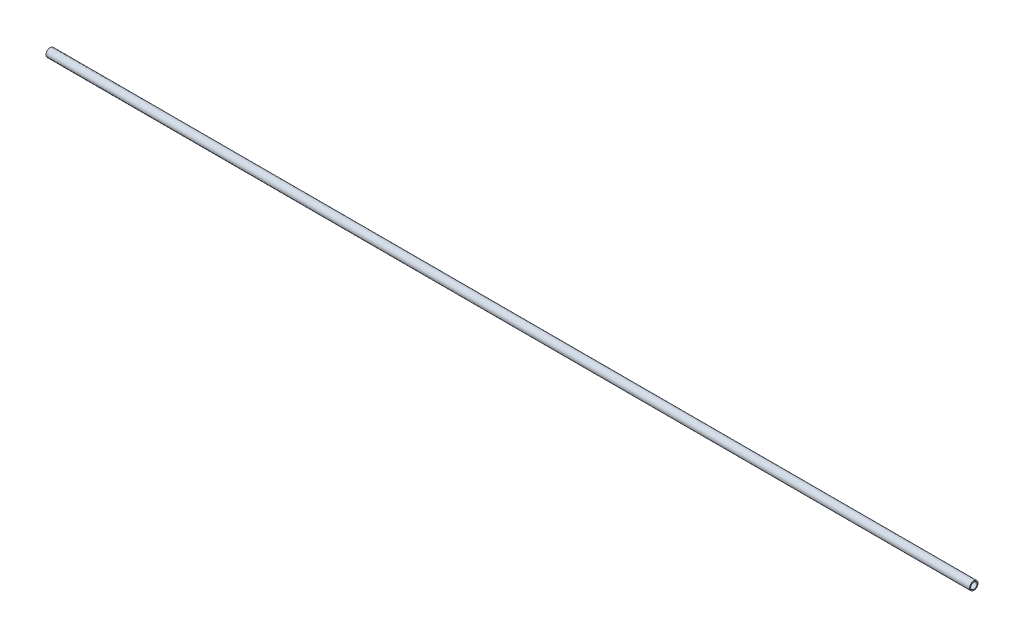
ISO-10303-21;
HEADER;
FILE_DESCRIPTION(('STEP AP214'),'2;1');
FILE_NAME('part.step','',(''),(''),'','','');
FILE_SCHEMA(('AUTOMOTIVE_DESIGN { 1 0 10303 214 1 1 1 1 }'));
ENDSEC;
DATA;
#1=APPLICATION_CONTEXT('core data for automotive mechanical design processes');
#2=APPLICATION_PROTOCOL_DEFINITION('international standard','automotive_design',2000,#1);
#3=PRODUCT_CONTEXT('',#1,'mechanical');
#4=PRODUCT('Part','Part','',(#3));
#5=PRODUCT_RELATED_PRODUCT_CATEGORY('part','',(#4));
#6=PRODUCT_DEFINITION_FORMATION('','',#4);
#7=PRODUCT_DEFINITION_CONTEXT('part definition',#1,'design');
#8=PRODUCT_DEFINITION('design','',#6,#7);
#9=PRODUCT_DEFINITION_SHAPE('','',#8);
#10=(LENGTH_UNIT() NAMED_UNIT(*) SI_UNIT(.MILLI.,.METRE.));
#11=(NAMED_UNIT(*) PLANE_ANGLE_UNIT() SI_UNIT($,.RADIAN.));
#12=(NAMED_UNIT(*) SI_UNIT($,.STERADIAN.) SOLID_ANGLE_UNIT());
#13=UNCERTAINTY_MEASURE_WITH_UNIT(LENGTH_MEASURE(1.E-05),#10,'distance_accuracy_value','');
#14=(GEOMETRIC_REPRESENTATION_CONTEXT(3) GLOBAL_UNCERTAINTY_ASSIGNED_CONTEXT((#13)) GLOBAL_UNIT_ASSIGNED_CONTEXT((#10,
#11,#12)) REPRESENTATION_CONTEXT('',''));
#15=CARTESIAN_POINT('',(0.,0.,0.));
#16=DIRECTION('',(0.,0.,1.));
#17=DIRECTION('',(1.,0.,0.));
#18=AXIS2_PLACEMENT_3D('',#15,#16,#17);
#19=CARTESIAN_POINT('',(2800.,0.,0.));
#20=DIRECTION('',(1.,0.,0.));
#21=DIRECTION('',(0.,0.,-1.));
#22=AXIS2_PLACEMENT_3D('',#19,#20,#21);
#23=PLANE('',#22);
#24=CARTESIAN_POINT('',(2800.,0.,0.));
#25=DIRECTION('',(1.,0.,0.));
#26=DIRECTION('',(0.,0.,-1.));
#27=AXIS2_PLACEMENT_3D('',#24,#25,#26);
#28=CIRCLE('',#27,12.7);
#29=CARTESIAN_POINT('',(2800.,0.,-12.7));
#30=VERTEX_POINT('',#29);
#31=EDGE_CURVE('E10',#30,#30,#28,.T.);
#32=ORIENTED_EDGE('',*,*,#31,.T.);
#33=EDGE_LOOP('',(#32));
#34=FACE_BOUND('',#33,.T.);
#35=CARTESIAN_POINT('',(2800.,0.,0.));
#36=DIRECTION('',(1.,0.,0.));
#37=DIRECTION('',(0.,0.,-1.));
#38=AXIS2_PLACEMENT_3D('',#35,#36,#37);
#39=CIRCLE('',#38,9.652);
#40=CARTESIAN_POINT('',(2800.,0.,-9.652));
#41=VERTEX_POINT('',#40);
#42=EDGE_CURVE('E47',#41,#41,#39,.T.);
#43=ORIENTED_EDGE('',*,*,#42,.F.);
#44=EDGE_LOOP('',(#43));
#45=FACE_BOUND('',#44,.T.);
#46=ADVANCED_FACE('F36',(#34,#45),#23,.T.);
#47=CARTESIAN_POINT('',(0.,0.,0.));
#48=DIRECTION('',(1.,0.,0.));
#49=DIRECTION('',(0.,0.,-1.));
#50=AXIS2_PLACEMENT_3D('',#47,#48,#49);
#51=PLANE('',#50);
#52=CARTESIAN_POINT('',(0.,0.,0.));
#53=DIRECTION('',(1.,0.,0.));
#54=DIRECTION('',(0.,0.,-1.));
#55=AXIS2_PLACEMENT_3D('',#52,#53,#54);
#56=CIRCLE('',#55,12.7);
#57=CARTESIAN_POINT('',(0.,0.,-12.7));
#58=VERTEX_POINT('',#57);
#59=EDGE_CURVE('E40',#58,#58,#56,.T.);
#60=ORIENTED_EDGE('',*,*,#59,.F.);
#61=EDGE_LOOP('',(#60));
#62=FACE_BOUND('',#61,.T.);
#63=CARTESIAN_POINT('',(0.,0.,0.));
#64=DIRECTION('',(1.,0.,0.));
#65=DIRECTION('',(0.,0.,-1.));
#66=AXIS2_PLACEMENT_3D('',#63,#64,#65);
#67=CIRCLE('',#66,9.652);
#68=CARTESIAN_POINT('',(0.,0.,-9.652));
#69=VERTEX_POINT('',#68);
#70=EDGE_CURVE('E49',#69,#69,#67,.T.);
#71=ORIENTED_EDGE('',*,*,#70,.T.);
#72=EDGE_LOOP('',(#71));
#73=FACE_BOUND('',#72,.T.);
#74=ADVANCED_FACE('F59',(#62,#73),#51,.F.);
#75=CARTESIAN_POINT('',(2800.,0.,0.));
#76=DIRECTION('',(-1.,0.,0.));
#77=DIRECTION('',(0.,0.,1.));
#78=AXIS2_PLACEMENT_3D('',#75,#76,#77);
#79=CYLINDRICAL_SURFACE('',#78,12.7);
#80=ORIENTED_EDGE('',*,*,#31,.F.);
#81=EDGE_LOOP('',(#80));
#82=FACE_BOUND('',#81,.T.);
#83=ORIENTED_EDGE('',*,*,#59,.T.);
#84=EDGE_LOOP('',(#83));
#85=FACE_BOUND('',#84,.T.);
#86=ADVANCED_FACE('F38',(#82,#85),#79,.T.);
#87=CARTESIAN_POINT('',(2800.,0.,0.));
#88=DIRECTION('',(-1.,0.,0.));
#89=DIRECTION('',(0.,0.,1.));
#90=AXIS2_PLACEMENT_3D('',#87,#88,#89);
#91=CYLINDRICAL_SURFACE('',#90,9.652);
#92=ORIENTED_EDGE('',*,*,#42,.T.);
#93=EDGE_LOOP('',(#92));
#94=FACE_BOUND('',#93,.T.);
#95=ORIENTED_EDGE('',*,*,#70,.F.);
#96=EDGE_LOOP('',(#95));
#97=FACE_BOUND('',#96,.T.);
#98=ADVANCED_FACE('F55',(#94,#97),#91,.F.);
#99=CLOSED_SHELL('',(#46,#74,#86,#98));
#100=MANIFOLD_SOLID_BREP('B2',#99);
#101=ADVANCED_BREP_SHAPE_REPRESENTATION('',(#18,#100),#14);
#102=SHAPE_DEFINITION_REPRESENTATION(#9,#101);
ENDSEC;
END-ISO-10303-21;
